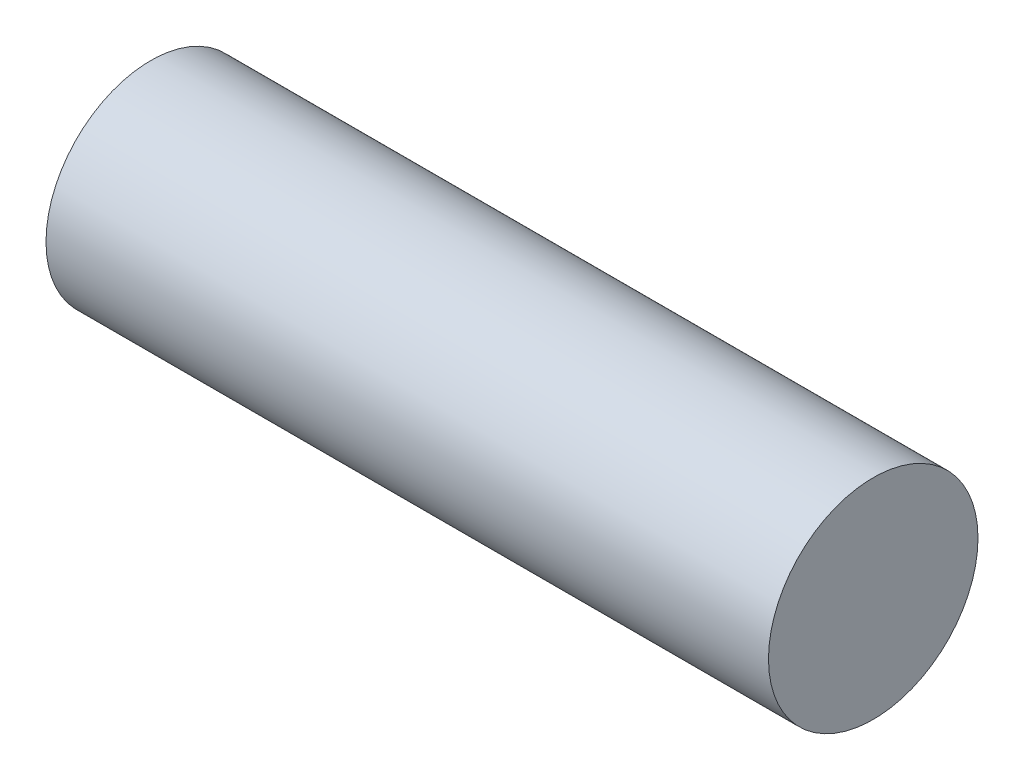
ISO-10303-21;
HEADER;
FILE_DESCRIPTION(('STEP AP214'),'2;1');
FILE_NAME('part.step','',(''),(''),'','','');
FILE_SCHEMA(('AUTOMOTIVE_DESIGN { 1 0 10303 214 1 1 1 1 }'));
ENDSEC;
DATA;
#1=APPLICATION_CONTEXT('core data for automotive mechanical design processes');
#2=APPLICATION_PROTOCOL_DEFINITION('international standard','automotive_design',2000,#1);
#3=PRODUCT_CONTEXT('',#1,'mechanical');
#4=PRODUCT('Part','Part','',(#3));
#5=PRODUCT_RELATED_PRODUCT_CATEGORY('part','',(#4));
#6=PRODUCT_DEFINITION_FORMATION('','',#4);
#7=PRODUCT_DEFINITION_CONTEXT('part definition',#1,'design');
#8=PRODUCT_DEFINITION('design','',#6,#7);
#9=PRODUCT_DEFINITION_SHAPE('','',#8);
#10=(LENGTH_UNIT() NAMED_UNIT(*) SI_UNIT(.MILLI.,.METRE.));
#11=(NAMED_UNIT(*) PLANE_ANGLE_UNIT() SI_UNIT($,.RADIAN.));
#12=(NAMED_UNIT(*) SI_UNIT($,.STERADIAN.) SOLID_ANGLE_UNIT());
#13=UNCERTAINTY_MEASURE_WITH_UNIT(LENGTH_MEASURE(1.E-05),#10,'distance_accuracy_value','');
#14=(GEOMETRIC_REPRESENTATION_CONTEXT(3) GLOBAL_UNCERTAINTY_ASSIGNED_CONTEXT((#13)) GLOBAL_UNIT_ASSIGNED_CONTEXT((#10,
#11,#12)) REPRESENTATION_CONTEXT('',''));
#15=CARTESIAN_POINT('',(0.,0.,0.));
#16=DIRECTION('',(0.,0.,1.));
#17=DIRECTION('',(1.,0.,0.));
#18=AXIS2_PLACEMENT_3D('',#15,#16,#17);
#19=CARTESIAN_POINT('',(25.,0.,0.));
#20=DIRECTION('',(-1.,0.,0.));
#21=DIRECTION('',(0.,0.,1.));
#22=AXIS2_PLACEMENT_3D('',#19,#20,#21);
#23=CYLINDRICAL_SURFACE('',#22,7.25);
#24=CARTESIAN_POINT('',(25.,0.,0.));
#25=DIRECTION('',(1.,0.,0.));
#26=DIRECTION('',(0.,0.,-1.));
#27=AXIS2_PLACEMENT_3D('',#24,#25,#26);
#28=CIRCLE('',#27,7.25);
#29=CARTESIAN_POINT('',(25.,0.,-7.25));
#30=VERTEX_POINT('',#29);
#31=EDGE_CURVE('E10',#30,#30,#28,.T.);
#32=ORIENTED_EDGE('',*,*,#31,.F.);
#33=EDGE_LOOP('',(#32));
#34=FACE_BOUND('',#33,.T.);
#35=CARTESIAN_POINT('',(-25.,0.,0.));
#36=DIRECTION('',(1.,0.,0.));
#37=DIRECTION('',(0.,0.,-1.));
#38=AXIS2_PLACEMENT_3D('',#35,#36,#37);
#39=CIRCLE('',#38,7.25);
#40=CARTESIAN_POINT('',(-25.,0.,-7.25));
#41=VERTEX_POINT('',#40);
#42=EDGE_CURVE('E40',#41,#41,#39,.T.);
#43=ORIENTED_EDGE('',*,*,#42,.T.);
#44=EDGE_LOOP('',(#43));
#45=FACE_BOUND('',#44,.T.);
#46=ADVANCED_FACE('F37',(#34,#45),#23,.T.);
#47=CARTESIAN_POINT('',(25.,0.,0.));
#48=DIRECTION('',(1.,0.,0.));
#49=DIRECTION('',(0.,0.,-1.));
#50=AXIS2_PLACEMENT_3D('',#47,#48,#49);
#51=PLANE('',#50);
#52=ORIENTED_EDGE('',*,*,#31,.T.);
#53=EDGE_LOOP('',(#52));
#54=FACE_BOUND('',#53,.T.);
#55=ADVANCED_FACE('F54',(#54),#51,.T.);
#56=CARTESIAN_POINT('',(-25.,0.,0.));
#57=DIRECTION('',(1.,0.,0.));
#58=DIRECTION('',(0.,0.,-1.));
#59=AXIS2_PLACEMENT_3D('',#56,#57,#58);
#60=PLANE('',#59);
#61=ORIENTED_EDGE('',*,*,#42,.F.);
#62=EDGE_LOOP('',(#61));
#63=FACE_BOUND('',#62,.T.);
#64=ADVANCED_FACE('F52',(#63),#60,.F.);
#65=CLOSED_SHELL('',(#46,#55,#64));
#66=MANIFOLD_SOLID_BREP('B2',#65);
#67=ADVANCED_BREP_SHAPE_REPRESENTATION('',(#18,#66),#14);
#68=SHAPE_DEFINITION_REPRESENTATION(#9,#67);
ENDSEC;
END-ISO-10303-21;
